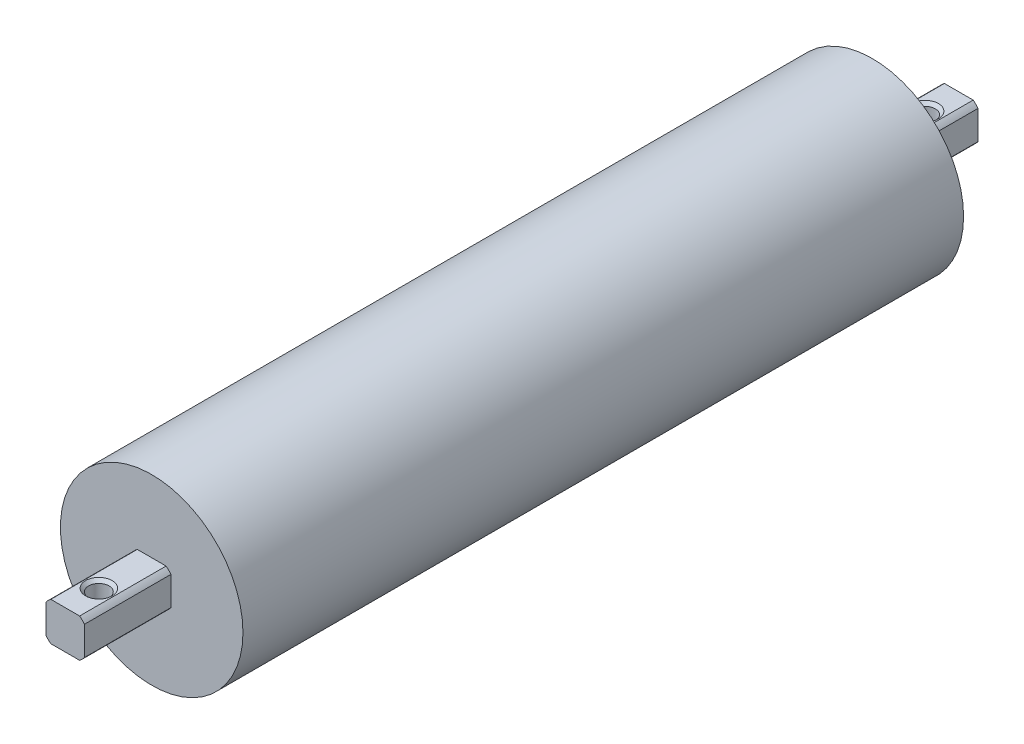
ISO-10303-21;
HEADER;
FILE_DESCRIPTION(('STEP AP214'),'2;1');
FILE_NAME('part.step','',(''),(''),'','','');
FILE_SCHEMA(('AUTOMOTIVE_DESIGN { 1 0 10303 214 1 1 1 1 }'));
ENDSEC;
DATA;
#1=APPLICATION_CONTEXT('core data for automotive mechanical design processes');
#2=APPLICATION_PROTOCOL_DEFINITION('international standard','automotive_design',2000,#1);
#3=PRODUCT_CONTEXT('',#1,'mechanical');
#4=PRODUCT('Part','Part','',(#3));
#5=PRODUCT_RELATED_PRODUCT_CATEGORY('part','',(#4));
#6=PRODUCT_DEFINITION_FORMATION('','',#4);
#7=PRODUCT_DEFINITION_CONTEXT('part definition',#1,'design');
#8=PRODUCT_DEFINITION('design','',#6,#7);
#9=PRODUCT_DEFINITION_SHAPE('','',#8);
#10=(LENGTH_UNIT() NAMED_UNIT(*) SI_UNIT(.MILLI.,.METRE.));
#11=(NAMED_UNIT(*) PLANE_ANGLE_UNIT() SI_UNIT($,.RADIAN.));
#12=(NAMED_UNIT(*) SI_UNIT($,.STERADIAN.) SOLID_ANGLE_UNIT());
#13=UNCERTAINTY_MEASURE_WITH_UNIT(LENGTH_MEASURE(1.E-05),#10,'distance_accuracy_value','');
#14=(GEOMETRIC_REPRESENTATION_CONTEXT(3) GLOBAL_UNCERTAINTY_ASSIGNED_CONTEXT((#13)) GLOBAL_UNIT_ASSIGNED_CONTEXT((#10,
#11,#12)) REPRESENTATION_CONTEXT('',''));
#15=CARTESIAN_POINT('',(0.,0.,0.));
#16=DIRECTION('',(0.,0.,1.));
#17=DIRECTION('',(1.,0.,0.));
#18=AXIS2_PLACEMENT_3D('',#15,#16,#17);
#19=CARTESIAN_POINT('',(0.,0.,-186.));
#20=DIRECTION('',(0.,0.,1.));
#21=DIRECTION('',(1.,0.,0.));
#22=AXIS2_PLACEMENT_3D('',#19,#20,#21);
#23=CYLINDRICAL_SURFACE('',#22,10.);
#24=DIRECTION('',(0.,0.,1.));
#25=VECTOR('',#24,1.);
#26=CARTESIAN_POINT('',(8.,-6.00000000000001,-186.));
#27=LINE('',#26,#25);
#28=CARTESIAN_POINT('',(8.,-6.00000000000001,-150.));
#29=VERTEX_POINT('',#28);
#30=CARTESIAN_POINT('',(8.,-6.00000000000001,-186.));
#31=VERTEX_POINT('',#30);
#32=EDGE_CURVE('E193',#29,#31,#27,.F.);
#33=ORIENTED_EDGE('',*,*,#32,.F.);
#34=CARTESIAN_POINT('',(0.,0.,-150.));
#35=DIRECTION('',(0.,0.,1.));
#36=DIRECTION('',(1.,0.,0.));
#37=AXIS2_PLACEMENT_3D('',#34,#35,#36);
#38=CIRCLE('',#37,10.);
#39=CARTESIAN_POINT('',(6.,-8.,-150.));
#40=VERTEX_POINT('',#39);
#41=EDGE_CURVE('E201',#40,#29,#38,.T.);
#42=ORIENTED_EDGE('',*,*,#41,.F.);
#43=DIRECTION('',(0.,0.,1.));
#44=VECTOR('',#43,1.);
#45=CARTESIAN_POINT('',(6.,-8.,-186.));
#46=LINE('',#45,#44);
#47=CARTESIAN_POINT('',(6.,-8.,-186.));
#48=VERTEX_POINT('',#47);
#49=EDGE_CURVE('E171',#48,#40,#46,.T.);
#50=ORIENTED_EDGE('',*,*,#49,.F.);
#51=CARTESIAN_POINT('',(0.,0.,-186.));
#52=DIRECTION('',(0.,0.,1.));
#53=DIRECTION('',(1.,0.,0.));
#54=AXIS2_PLACEMENT_3D('',#51,#52,#53);
#55=CIRCLE('',#54,10.);
#56=EDGE_CURVE('E179',#48,#31,#55,.T.);
#57=ORIENTED_EDGE('',*,*,#56,.T.);
#58=EDGE_LOOP('',(#33,#42,#50,#57));
#59=FACE_BOUND('',#58,.T.);
#60=ADVANCED_FACE('F47',(#59),#23,.T.);
#61=DIRECTION('',(0.,0.,1.));
#62=VECTOR('',#61,1.);
#63=CARTESIAN_POINT('',(8.,6.00000000000001,-186.));
#64=LINE('',#63,#62);
#65=CARTESIAN_POINT('',(8.,6.00000000000001,-186.));
#66=VERTEX_POINT('',#65);
#67=CARTESIAN_POINT('',(8.,6.00000000000001,-150.));
#68=VERTEX_POINT('',#67);
#69=EDGE_CURVE('E406',#66,#68,#64,.T.);
#70=ORIENTED_EDGE('',*,*,#69,.F.);
#71=CARTESIAN_POINT('',(6.,8.,-186.));
#72=VERTEX_POINT('',#71);
#73=EDGE_CURVE('E189',#66,#72,#55,.T.);
#74=ORIENTED_EDGE('',*,*,#73,.T.);
#75=DIRECTION('',(0.,0.,1.));
#76=VECTOR('',#75,1.);
#77=CARTESIAN_POINT('',(6.,8.,-186.));
#78=LINE('',#77,#76);
#79=CARTESIAN_POINT('',(6.,8.,-150.));
#80=VERTEX_POINT('',#79);
#81=EDGE_CURVE('E386',#80,#72,#78,.F.);
#82=ORIENTED_EDGE('',*,*,#81,.F.);
#83=EDGE_CURVE('E186',#68,#80,#38,.T.);
#84=ORIENTED_EDGE('',*,*,#83,.F.);
#85=EDGE_LOOP('',(#70,#74,#82,#84));
#86=FACE_BOUND('',#85,.T.);
#87=ADVANCED_FACE('F358',(#86),#23,.T.);
#88=DIRECTION('',(0.,0.,1.));
#89=VECTOR('',#88,1.);
#90=CARTESIAN_POINT('',(-6.,8.,-186.));
#91=LINE('',#90,#89);
#92=CARTESIAN_POINT('',(-6.,8.,-186.));
#93=VERTEX_POINT('',#92);
#94=CARTESIAN_POINT('',(-6.,8.,-150.));
#95=VERTEX_POINT('',#94);
#96=EDGE_CURVE('E385',#93,#95,#91,.T.);
#97=ORIENTED_EDGE('',*,*,#96,.F.);
#98=CARTESIAN_POINT('',(-8.,5.99999999999999,-186.));
#99=VERTEX_POINT('',#98);
#100=EDGE_CURVE('E182',#93,#99,#55,.T.);
#101=ORIENTED_EDGE('',*,*,#100,.T.);
#102=DIRECTION('',(0.,0.,1.));
#103=VECTOR('',#102,1.);
#104=CARTESIAN_POINT('',(-8.,5.99999999999999,-186.));
#105=LINE('',#104,#103);
#106=CARTESIAN_POINT('',(-8.,5.99999999999999,-150.));
#107=VERTEX_POINT('',#106);
#108=EDGE_CURVE('E388',#107,#99,#105,.F.);
#109=ORIENTED_EDGE('',*,*,#108,.F.);
#110=EDGE_CURVE('E199',#95,#107,#38,.T.);
#111=ORIENTED_EDGE('',*,*,#110,.F.);
#112=EDGE_LOOP('',(#97,#101,#109,#111));
#113=FACE_BOUND('',#112,.T.);
#114=ADVANCED_FACE('F361',(#113),#23,.T.);
#115=CARTESIAN_POINT('',(0.,0.,186.));
#116=DIRECTION('',(0.,0.,-1.));
#117=DIRECTION('',(-1.,0.,0.));
#118=AXIS2_PLACEMENT_3D('',#115,#116,#117);
#119=CYLINDRICAL_SURFACE('',#118,10.);
#120=DIRECTION('',(0.,0.,-1.));
#121=VECTOR('',#120,1.);
#122=CARTESIAN_POINT('',(8.,-6.00000000000001,186.));
#123=LINE('',#122,#121);
#124=CARTESIAN_POINT('',(8.,-6.00000000000001,186.));
#125=VERTEX_POINT('',#124);
#126=CARTESIAN_POINT('',(8.,-6.00000000000001,150.));
#127=VERTEX_POINT('',#126);
#128=EDGE_CURVE('E258',#125,#127,#123,.T.);
#129=ORIENTED_EDGE('',*,*,#128,.F.);
#130=CARTESIAN_POINT('',(0.,0.,186.));
#131=DIRECTION('',(0.,0.,1.));
#132=DIRECTION('',(1.,0.,0.));
#133=AXIS2_PLACEMENT_3D('',#130,#131,#132);
#134=CIRCLE('',#133,10.);
#135=CARTESIAN_POINT('',(6.,-8.,186.));
#136=VERTEX_POINT('',#135);
#137=EDGE_CURVE('E263',#136,#125,#134,.T.);
#138=ORIENTED_EDGE('',*,*,#137,.F.);
#139=DIRECTION('',(0.,0.,-1.));
#140=VECTOR('',#139,1.);
#141=CARTESIAN_POINT('',(6.,-8.,186.));
#142=LINE('',#141,#140);
#143=CARTESIAN_POINT('',(6.,-8.,150.));
#144=VERTEX_POINT('',#143);
#145=EDGE_CURVE('E252',#144,#136,#142,.F.);
#146=ORIENTED_EDGE('',*,*,#145,.F.);
#147=CARTESIAN_POINT('',(0.,0.,150.));
#148=DIRECTION('',(0.,0.,1.));
#149=DIRECTION('',(1.,0.,0.));
#150=AXIS2_PLACEMENT_3D('',#147,#148,#149);
#151=CIRCLE('',#150,10.);
#152=EDGE_CURVE('E274',#144,#127,#151,.T.);
#153=ORIENTED_EDGE('',*,*,#152,.T.);
#154=EDGE_LOOP('',(#129,#138,#146,#153));
#155=FACE_BOUND('',#154,.T.);
#156=ADVANCED_FACE('F319',(#155),#119,.T.);
#157=DIRECTION('',(0.,0.,-1.));
#158=VECTOR('',#157,1.);
#159=CARTESIAN_POINT('',(8.,6.00000000000001,186.));
#160=LINE('',#159,#158);
#161=CARTESIAN_POINT('',(8.,6.00000000000001,150.));
#162=VERTEX_POINT('',#161);
#163=CARTESIAN_POINT('',(8.,6.00000000000001,186.));
#164=VERTEX_POINT('',#163);
#165=EDGE_CURVE('E260',#162,#164,#160,.F.);
#166=ORIENTED_EDGE('',*,*,#165,.F.);
#167=CARTESIAN_POINT('',(6.,8.,150.));
#168=VERTEX_POINT('',#167);
#169=EDGE_CURVE('E231',#162,#168,#151,.T.);
#170=ORIENTED_EDGE('',*,*,#169,.T.);
#171=DIRECTION('',(0.,0.,-1.));
#172=VECTOR('',#171,1.);
#173=CARTESIAN_POINT('',(6.,8.,186.));
#174=LINE('',#173,#172);
#175=CARTESIAN_POINT('',(6.,8.,186.));
#176=VERTEX_POINT('',#175);
#177=EDGE_CURVE('E245',#176,#168,#174,.T.);
#178=ORIENTED_EDGE('',*,*,#177,.F.);
#179=EDGE_CURVE('E262',#164,#176,#134,.T.);
#180=ORIENTED_EDGE('',*,*,#179,.F.);
#181=EDGE_LOOP('',(#166,#170,#178,#180));
#182=FACE_BOUND('',#181,.T.);
#183=ADVANCED_FACE('F342',(#182),#119,.T.);
#184=DIRECTION('',(0.,0.,-1.));
#185=VECTOR('',#184,1.);
#186=CARTESIAN_POINT('',(-6.,-8.,186.));
#187=LINE('',#186,#185);
#188=CARTESIAN_POINT('',(-6.,-8.,186.));
#189=VERTEX_POINT('',#188);
#190=CARTESIAN_POINT('',(-6.,-8.,150.));
#191=VERTEX_POINT('',#190);
#192=EDGE_CURVE('E251',#189,#191,#187,.T.);
#193=ORIENTED_EDGE('',*,*,#192,.F.);
#194=CARTESIAN_POINT('',(-8.,-5.99999999999999,186.));
#195=VERTEX_POINT('',#194);
#196=EDGE_CURVE('E324',#195,#189,#134,.T.);
#197=ORIENTED_EDGE('',*,*,#196,.F.);
#198=DIRECTION('',(0.,0.,-1.));
#199=VECTOR('',#198,1.);
#200=CARTESIAN_POINT('',(-8.,-6.,186.));
#201=LINE('',#200,#199);
#202=CARTESIAN_POINT('',(-8.,-6.,150.));
#203=VERTEX_POINT('',#202);
#204=EDGE_CURVE('E244',#203,#195,#201,.F.);
#205=ORIENTED_EDGE('',*,*,#204,.F.);
#206=EDGE_CURVE('E310',#203,#191,#151,.T.);
#207=ORIENTED_EDGE('',*,*,#206,.T.);
#208=EDGE_LOOP('',(#193,#197,#205,#207));
#209=FACE_BOUND('',#208,.T.);
#210=ADVANCED_FACE('F311',(#209),#119,.T.);
#211=DIRECTION('',(0.,0.,-1.));
#212=VECTOR('',#211,1.);
#213=CARTESIAN_POINT('',(-8.,5.99999999999999,186.));
#214=LINE('',#213,#212);
#215=CARTESIAN_POINT('',(-8.,5.99999999999999,186.));
#216=VERTEX_POINT('',#215);
#217=CARTESIAN_POINT('',(-8.,5.99999999999999,150.));
#218=VERTEX_POINT('',#217);
#219=EDGE_CURVE('E247',#216,#218,#214,.T.);
#220=ORIENTED_EDGE('',*,*,#219,.F.);
#221=CARTESIAN_POINT('',(-6.,8.,186.));
#222=VERTEX_POINT('',#221);
#223=EDGE_CURVE('E268',#222,#216,#134,.T.);
#224=ORIENTED_EDGE('',*,*,#223,.F.);
#225=DIRECTION('',(0.,0.,-1.));
#226=VECTOR('',#225,1.);
#227=CARTESIAN_POINT('',(-6.,8.,186.));
#228=LINE('',#227,#226);
#229=CARTESIAN_POINT('',(-6.,8.,150.));
#230=VERTEX_POINT('',#229);
#231=EDGE_CURVE('E225',#230,#222,#228,.F.);
#232=ORIENTED_EDGE('',*,*,#231,.F.);
#233=EDGE_CURVE('E271',#230,#218,#151,.T.);
#234=ORIENTED_EDGE('',*,*,#233,.T.);
#235=EDGE_LOOP('',(#220,#224,#232,#234));
#236=FACE_BOUND('',#235,.T.);
#237=ADVANCED_FACE('F335',(#236),#119,.T.);
#238=CARTESIAN_POINT('',(0.,0.,186.));
#239=DIRECTION('',(0.,0.,1.));
#240=DIRECTION('',(1.,0.,0.));
#241=AXIS2_PLACEMENT_3D('',#238,#239,#240);
#242=PLANE('',#241);
#243=ORIENTED_EDGE('',*,*,#137,.T.);
#244=DIRECTION('',(0.,1.,0.));
#245=VECTOR('',#244,1.);
#246=CARTESIAN_POINT('',(8.,8.,186.));
#247=LINE('',#246,#245);
#248=EDGE_CURVE('E222',#125,#164,#247,.T.);
#249=ORIENTED_EDGE('',*,*,#248,.T.);
#250=ORIENTED_EDGE('',*,*,#179,.T.);
#251=DIRECTION('',(-1.,0.,0.));
#252=VECTOR('',#251,1.);
#253=CARTESIAN_POINT('',(-8.,8.,186.));
#254=LINE('',#253,#252);
#255=EDGE_CURVE('E226',#176,#222,#254,.T.);
#256=ORIENTED_EDGE('',*,*,#255,.T.);
#257=ORIENTED_EDGE('',*,*,#223,.T.);
#258=DIRECTION('',(0.,-1.,0.));
#259=VECTOR('',#258,1.);
#260=CARTESIAN_POINT('',(-8.,8.,186.));
#261=LINE('',#260,#259);
#262=EDGE_CURVE('E235',#216,#195,#261,.T.);
#263=ORIENTED_EDGE('',*,*,#262,.T.);
#264=ORIENTED_EDGE('',*,*,#196,.T.);
#265=DIRECTION('',(1.,0.,0.));
#266=VECTOR('',#265,1.);
#267=CARTESIAN_POINT('',(-8.,-8.,186.));
#268=LINE('',#267,#266);
#269=EDGE_CURVE('E227',#189,#136,#268,.T.);
#270=ORIENTED_EDGE('',*,*,#269,.T.);
#271=EDGE_LOOP('',(#243,#249,#250,#256,#257,#263,#264,#270));
#272=FACE_BOUND('',#271,.T.);
#273=ADVANCED_FACE('F325',(#272),#242,.T.);
#274=CARTESIAN_POINT('',(0.,0.,150.));
#275=DIRECTION('',(0.,0.,-1.));
#276=DIRECTION('',(-1.,0.,0.));
#277=AXIS2_PLACEMENT_3D('',#274,#275,#276);
#278=CYLINDRICAL_SURFACE('',#277,38.);
#279=CARTESIAN_POINT('',(0.,0.,150.));
#280=DIRECTION('',(0.,0.,1.));
#281=DIRECTION('',(1.,0.,0.));
#282=AXIS2_PLACEMENT_3D('',#279,#280,#281);
#283=CIRCLE('',#282,38.);
#284=CARTESIAN_POINT('',(38.,0.,150.));
#285=VERTEX_POINT('',#284);
#286=EDGE_CURVE('E273',#285,#285,#283,.T.);
#287=ORIENTED_EDGE('',*,*,#286,.F.);
#288=EDGE_LOOP('',(#287));
#289=FACE_BOUND('',#288,.T.);
#290=CARTESIAN_POINT('',(0.,0.,-150.));
#291=DIRECTION('',(0.,0.,1.));
#292=DIRECTION('',(1.,0.,0.));
#293=AXIS2_PLACEMENT_3D('',#290,#291,#292);
#294=CIRCLE('',#293,38.);
#295=CARTESIAN_POINT('',(38.,0.,-150.));
#296=VERTEX_POINT('',#295);
#297=EDGE_CURVE('E267',#296,#296,#294,.T.);
#298=ORIENTED_EDGE('',*,*,#297,.T.);
#299=EDGE_LOOP('',(#298));
#300=FACE_BOUND('',#299,.T.);
#301=ADVANCED_FACE('F51',(#289,#300),#278,.T.);
#302=CARTESIAN_POINT('',(0.,0.,150.));
#303=DIRECTION('',(0.,0.,1.));
#304=DIRECTION('',(1.,0.,0.));
#305=AXIS2_PLACEMENT_3D('',#302,#303,#304);
#306=PLANE('',#305);
#307=ORIENTED_EDGE('',*,*,#152,.F.);
#308=DIRECTION('',(1.,0.,0.));
#309=VECTOR('',#308,1.);
#310=CARTESIAN_POINT('',(-8.,-8.,150.));
#311=LINE('',#310,#309);
#312=EDGE_CURVE('E217',#191,#144,#311,.T.);
#313=ORIENTED_EDGE('',*,*,#312,.F.);
#314=ORIENTED_EDGE('',*,*,#206,.F.);
#315=DIRECTION('',(0.,-1.,0.));
#316=VECTOR('',#315,1.);
#317=CARTESIAN_POINT('',(-8.,8.,150.));
#318=LINE('',#317,#316);
#319=EDGE_CURVE('E216',#218,#203,#318,.T.);
#320=ORIENTED_EDGE('',*,*,#319,.F.);
#321=ORIENTED_EDGE('',*,*,#233,.F.);
#322=DIRECTION('',(-1.,0.,0.));
#323=VECTOR('',#322,1.);
#324=CARTESIAN_POINT('',(-8.,8.,150.));
#325=LINE('',#324,#323);
#326=EDGE_CURVE('E214',#168,#230,#325,.T.);
#327=ORIENTED_EDGE('',*,*,#326,.F.);
#328=ORIENTED_EDGE('',*,*,#169,.F.);
#329=DIRECTION('',(0.,1.,0.));
#330=VECTOR('',#329,1.);
#331=CARTESIAN_POINT('',(8.,8.,150.));
#332=LINE('',#331,#330);
#333=EDGE_CURVE('E208',#127,#162,#332,.T.);
#334=ORIENTED_EDGE('',*,*,#333,.F.);
#335=EDGE_LOOP('',(#307,#313,#314,#320,#321,#327,#328,#334));
#336=FACE_BOUND('',#335,.T.);
#337=ORIENTED_EDGE('',*,*,#286,.T.);
#338=EDGE_LOOP('',(#337));
#339=FACE_BOUND('',#338,.T.);
#340=ADVANCED_FACE('F302',(#336,#339),#306,.T.);
#341=CARTESIAN_POINT('',(0.,0.,-150.));
#342=DIRECTION('',(0.,0.,1.));
#343=DIRECTION('',(1.,0.,0.));
#344=AXIS2_PLACEMENT_3D('',#341,#342,#343);
#345=PLANE('',#344);
#346=ORIENTED_EDGE('',*,*,#41,.T.);
#347=DIRECTION('',(0.,1.,0.));
#348=VECTOR('',#347,1.);
#349=CARTESIAN_POINT('',(8.,8.,-150.));
#350=LINE('',#349,#348);
#351=EDGE_CURVE('E457',#29,#68,#350,.T.);
#352=ORIENTED_EDGE('',*,*,#351,.T.);
#353=ORIENTED_EDGE('',*,*,#83,.T.);
#354=DIRECTION('',(-1.,0.,0.));
#355=VECTOR('',#354,1.);
#356=CARTESIAN_POINT('',(-8.,8.,-150.));
#357=LINE('',#356,#355);
#358=EDGE_CURVE('E405',#80,#95,#357,.T.);
#359=ORIENTED_EDGE('',*,*,#358,.T.);
#360=ORIENTED_EDGE('',*,*,#110,.T.);
#361=DIRECTION('',(0.,-1.,0.));
#362=VECTOR('',#361,1.);
#363=CARTESIAN_POINT('',(-8.,8.,-150.));
#364=LINE('',#363,#362);
#365=CARTESIAN_POINT('',(-8.,-5.99999999999999,-150.));
#366=VERTEX_POINT('',#365);
#367=EDGE_CURVE('E424',#107,#366,#364,.T.);
#368=ORIENTED_EDGE('',*,*,#367,.T.);
#369=CARTESIAN_POINT('',(-6.,-8.,-150.));
#370=VERTEX_POINT('',#369);
#371=EDGE_CURVE('E420',#366,#370,#38,.T.);
#372=ORIENTED_EDGE('',*,*,#371,.T.);
#373=DIRECTION('',(1.,0.,0.));
#374=VECTOR('',#373,1.);
#375=CARTESIAN_POINT('',(-8.,-8.,-150.));
#376=LINE('',#375,#374);
#377=EDGE_CURVE('E165',#370,#40,#376,.T.);
#378=ORIENTED_EDGE('',*,*,#377,.T.);
#379=EDGE_LOOP('',(#346,#352,#353,#359,#360,#368,#372,#378));
#380=FACE_BOUND('',#379,.T.);
#381=ORIENTED_EDGE('',*,*,#297,.F.);
#382=EDGE_LOOP('',(#381));
#383=FACE_BOUND('',#382,.T.);
#384=ADVANCED_FACE('F421',(#380,#383),#345,.F.);
#385=CARTESIAN_POINT('',(-8.,8.,150.));
#386=DIRECTION('',(0.,1.,0.));
#387=DIRECTION('',(0.,0.,1.));
#388=AXIS2_PLACEMENT_3D('',#385,#386,#387);
#389=PLANE('',#388);
#390=CARTESIAN_POINT('',(0.,8.,172.));
#391=DIRECTION('',(0.,1.,0.));
#392=DIRECTION('',(0.,0.,1.));
#393=AXIS2_PLACEMENT_3D('',#390,#391,#392);
#394=CIRCLE('',#393,5.525);
#395=CARTESIAN_POINT('',(0.,8.,177.525));
#396=VERTEX_POINT('',#395);
#397=EDGE_CURVE('E191',#396,#396,#394,.T.);
#398=ORIENTED_EDGE('',*,*,#397,.F.);
#399=EDGE_LOOP('',(#398));
#400=FACE_BOUND('',#399,.T.);
#401=ORIENTED_EDGE('',*,*,#177,.T.);
#402=ORIENTED_EDGE('',*,*,#326,.T.);
#403=ORIENTED_EDGE('',*,*,#231,.T.);
#404=ORIENTED_EDGE('',*,*,#255,.F.);
#405=EDGE_LOOP('',(#401,#402,#403,#404));
#406=FACE_BOUND('',#405,.T.);
#407=ADVANCED_FACE('F527',(#400,#406),#389,.T.);
#408=CARTESIAN_POINT('',(-8.,8.,150.));
#409=DIRECTION('',(-1.,0.,0.));
#410=DIRECTION('',(0.,-1.,0.));
#411=AXIS2_PLACEMENT_3D('',#408,#409,#410);
#412=PLANE('',#411);
#413=ORIENTED_EDGE('',*,*,#219,.T.);
#414=ORIENTED_EDGE('',*,*,#319,.T.);
#415=ORIENTED_EDGE('',*,*,#204,.T.);
#416=ORIENTED_EDGE('',*,*,#262,.F.);
#417=EDGE_LOOP('',(#413,#414,#415,#416));
#418=FACE_BOUND('',#417,.T.);
#419=ADVANCED_FACE('F292',(#418),#412,.T.);
#420=CARTESIAN_POINT('',(-8.,-8.,150.));
#421=DIRECTION('',(0.,-1.,0.));
#422=DIRECTION('',(0.,0.,-1.));
#423=AXIS2_PLACEMENT_3D('',#420,#421,#422);
#424=PLANE('',#423);
#425=CARTESIAN_POINT('',(0.,-8.,172.));
#426=DIRECTION('',(0.,-1.,0.));
#427=DIRECTION('',(0.,0.,-1.));
#428=AXIS2_PLACEMENT_3D('',#425,#426,#427);
#429=CIRCLE('',#428,4.25);
#430=CARTESIAN_POINT('',(0.,-8.,167.75));
#431=VERTEX_POINT('',#430);
#432=EDGE_CURVE('E209',#431,#431,#429,.T.);
#433=ORIENTED_EDGE('',*,*,#432,.F.);
#434=EDGE_LOOP('',(#433));
#435=FACE_BOUND('',#434,.T.);
#436=ORIENTED_EDGE('',*,*,#192,.T.);
#437=ORIENTED_EDGE('',*,*,#312,.T.);
#438=ORIENTED_EDGE('',*,*,#145,.T.);
#439=ORIENTED_EDGE('',*,*,#269,.F.);
#440=EDGE_LOOP('',(#436,#437,#438,#439));
#441=FACE_BOUND('',#440,.T.);
#442=ADVANCED_FACE('F287',(#435,#441),#424,.T.);
#443=CARTESIAN_POINT('',(8.,8.,150.));
#444=DIRECTION('',(1.,0.,0.));
#445=DIRECTION('',(0.,0.,-1.));
#446=AXIS2_PLACEMENT_3D('',#443,#444,#445);
#447=PLANE('',#446);
#448=ORIENTED_EDGE('',*,*,#128,.T.);
#449=ORIENTED_EDGE('',*,*,#333,.T.);
#450=ORIENTED_EDGE('',*,*,#165,.T.);
#451=ORIENTED_EDGE('',*,*,#248,.F.);
#452=EDGE_LOOP('',(#448,#449,#450,#451));
#453=FACE_BOUND('',#452,.T.);
#454=ADVANCED_FACE('F293',(#453),#447,.T.);
#455=CARTESIAN_POINT('',(0.,8.,172.));
#456=DIRECTION('',(0.,1.,0.));
#457=DIRECTION('',(0.,0.,1.));
#458=AXIS2_PLACEMENT_3D('',#455,#456,#457);
#459=CYLINDRICAL_SURFACE('',#458,4.25);
#460=ORIENTED_EDGE('',*,*,#432,.T.);
#461=EDGE_LOOP('',(#460));
#462=FACE_BOUND('',#461,.T.);
#463=CARTESIAN_POINT('',(0.,6.725,172.));
#464=DIRECTION('',(0.,1.,0.));
#465=DIRECTION('',(0.,0.,1.));
#466=AXIS2_PLACEMENT_3D('',#463,#464,#465);
#467=CIRCLE('',#466,4.25);
#468=CARTESIAN_POINT('',(0.,6.725,176.25));
#469=VERTEX_POINT('',#468);
#470=EDGE_CURVE('E204',#469,#469,#467,.T.);
#471=ORIENTED_EDGE('',*,*,#470,.T.);
#472=EDGE_LOOP('',(#471));
#473=FACE_BOUND('',#472,.T.);
#474=ADVANCED_FACE('F284',(#462,#473),#459,.F.);
#475=CARTESIAN_POINT('',(0.,8.,172.));
#476=DIRECTION('',(0.,1.,0.));
#477=DIRECTION('',(0.,0.,1.));
#478=AXIS2_PLACEMENT_3D('',#475,#476,#477);
#479=CONICAL_SURFACE('',#478,5.525,0.78539816339745);
#480=ORIENTED_EDGE('',*,*,#470,.F.);
#481=EDGE_LOOP('',(#480));
#482=FACE_BOUND('',#481,.T.);
#483=ORIENTED_EDGE('',*,*,#397,.T.);
#484=EDGE_LOOP('',(#483));
#485=FACE_BOUND('',#484,.T.);
#486=ADVANCED_FACE('F351',(#482,#485),#479,.F.);
#487=DIRECTION('',(0.,0.,1.));
#488=VECTOR('',#487,1.);
#489=CARTESIAN_POINT('',(-8.,-6.,-186.));
#490=LINE('',#489,#488);
#491=CARTESIAN_POINT('',(-8.,-6.,-186.));
#492=VERTEX_POINT('',#491);
#493=EDGE_CURVE('E167',#492,#366,#490,.T.);
#494=ORIENTED_EDGE('',*,*,#493,.F.);
#495=CARTESIAN_POINT('',(-6.,-8.,-186.));
#496=VERTEX_POINT('',#495);
#497=EDGE_CURVE('E180',#492,#496,#55,.T.);
#498=ORIENTED_EDGE('',*,*,#497,.T.);
#499=DIRECTION('',(0.,0.,1.));
#500=VECTOR('',#499,1.);
#501=CARTESIAN_POINT('',(-6.,-8.,-186.));
#502=LINE('',#501,#500);
#503=EDGE_CURVE('E163',#370,#496,#502,.F.);
#504=ORIENTED_EDGE('',*,*,#503,.F.);
#505=ORIENTED_EDGE('',*,*,#371,.F.);
#506=EDGE_LOOP('',(#494,#498,#504,#505));
#507=FACE_BOUND('',#506,.T.);
#508=ADVANCED_FACE('F181',(#507),#23,.T.);
#509=CARTESIAN_POINT('',(0.,0.,-186.));
#510=DIRECTION('',(0.,0.,-1.));
#511=DIRECTION('',(1.,0.,0.));
#512=AXIS2_PLACEMENT_3D('',#509,#510,#511);
#513=PLANE('',#512);
#514=DIRECTION('',(1.,0.,0.));
#515=VECTOR('',#514,1.);
#516=CARTESIAN_POINT('',(-8.,-8.,-186.));
#517=LINE('',#516,#515);
#518=EDGE_CURVE('E12',#496,#48,#517,.T.);
#519=ORIENTED_EDGE('',*,*,#518,.F.);
#520=ORIENTED_EDGE('',*,*,#497,.F.);
#521=DIRECTION('',(0.,-1.,0.));
#522=VECTOR('',#521,1.);
#523=CARTESIAN_POINT('',(-8.,8.,-186.));
#524=LINE('',#523,#522);
#525=EDGE_CURVE('E72',#99,#492,#524,.T.);
#526=ORIENTED_EDGE('',*,*,#525,.F.);
#527=ORIENTED_EDGE('',*,*,#100,.F.);
#528=DIRECTION('',(-1.,0.,0.));
#529=VECTOR('',#528,1.);
#530=CARTESIAN_POINT('',(-8.,8.,-186.));
#531=LINE('',#530,#529);
#532=EDGE_CURVE('E392',#72,#93,#531,.T.);
#533=ORIENTED_EDGE('',*,*,#532,.F.);
#534=ORIENTED_EDGE('',*,*,#73,.F.);
#535=DIRECTION('',(0.,1.,0.));
#536=VECTOR('',#535,1.);
#537=CARTESIAN_POINT('',(8.,8.,-186.));
#538=LINE('',#537,#536);
#539=EDGE_CURVE('E56',#31,#66,#538,.T.);
#540=ORIENTED_EDGE('',*,*,#539,.F.);
#541=ORIENTED_EDGE('',*,*,#56,.F.);
#542=EDGE_LOOP('',(#519,#520,#526,#527,#533,#534,#540,#541));
#543=FACE_BOUND('',#542,.T.);
#544=ADVANCED_FACE('F176',(#543),#513,.T.);
#545=CARTESIAN_POINT('',(-8.,-8.,-150.));
#546=DIRECTION('',(0.,1.,0.));
#547=DIRECTION('',(0.,0.,1.));
#548=AXIS2_PLACEMENT_3D('',#545,#546,#547);
#549=PLANE('',#548);
#550=CARTESIAN_POINT('',(0.,-8.,-172.));
#551=DIRECTION('',(0.,1.,0.));
#552=DIRECTION('',(0.,0.,1.));
#553=AXIS2_PLACEMENT_3D('',#550,#551,#552);
#554=CIRCLE('',#553,4.25);
#555=CARTESIAN_POINT('',(0.,-8.,-167.75));
#556=VERTEX_POINT('',#555);
#557=EDGE_CURVE('E52',#556,#556,#554,.T.);
#558=ORIENTED_EDGE('',*,*,#557,.T.);
#559=EDGE_LOOP('',(#558));
#560=FACE_BOUND('',#559,.T.);
#561=ORIENTED_EDGE('',*,*,#503,.T.);
#562=ORIENTED_EDGE('',*,*,#518,.T.);
#563=ORIENTED_EDGE('',*,*,#49,.T.);
#564=ORIENTED_EDGE('',*,*,#377,.F.);
#565=EDGE_LOOP('',(#561,#562,#563,#564));
#566=FACE_BOUND('',#565,.T.);
#567=ADVANCED_FACE('F162',(#560,#566),#549,.F.);
#568=CARTESIAN_POINT('',(-8.,8.,-150.));
#569=DIRECTION('',(1.,0.,0.));
#570=DIRECTION('',(0.,1.,0.));
#571=AXIS2_PLACEMENT_3D('',#568,#569,#570);
#572=PLANE('',#571);
#573=ORIENTED_EDGE('',*,*,#108,.T.);
#574=ORIENTED_EDGE('',*,*,#525,.T.);
#575=ORIENTED_EDGE('',*,*,#493,.T.);
#576=ORIENTED_EDGE('',*,*,#367,.F.);
#577=EDGE_LOOP('',(#573,#574,#575,#576));
#578=FACE_BOUND('',#577,.T.);
#579=ADVANCED_FACE('F440',(#578),#572,.F.);
#580=CARTESIAN_POINT('',(-8.,8.,-150.));
#581=DIRECTION('',(0.,-1.,0.));
#582=DIRECTION('',(0.,0.,-1.));
#583=AXIS2_PLACEMENT_3D('',#580,#581,#582);
#584=PLANE('',#583);
#585=CARTESIAN_POINT('',(0.,8.,-172.));
#586=DIRECTION('',(0.,1.,0.));
#587=DIRECTION('',(0.,0.,1.));
#588=AXIS2_PLACEMENT_3D('',#585,#586,#587);
#589=CIRCLE('',#588,5.525);
#590=CARTESIAN_POINT('',(0.,8.,-166.475));
#591=VERTEX_POINT('',#590);
#592=EDGE_CURVE('E464',#591,#591,#589,.T.);
#593=ORIENTED_EDGE('',*,*,#592,.F.);
#594=EDGE_LOOP('',(#593));
#595=FACE_BOUND('',#594,.T.);
#596=ORIENTED_EDGE('',*,*,#81,.T.);
#597=ORIENTED_EDGE('',*,*,#532,.T.);
#598=ORIENTED_EDGE('',*,*,#96,.T.);
#599=ORIENTED_EDGE('',*,*,#358,.F.);
#600=EDGE_LOOP('',(#596,#597,#598,#599));
#601=FACE_BOUND('',#600,.T.);
#602=ADVANCED_FACE('F434',(#595,#601),#584,.F.);
#603=CARTESIAN_POINT('',(8.,8.,-150.));
#604=DIRECTION('',(-1.,0.,0.));
#605=DIRECTION('',(0.,0.,1.));
#606=AXIS2_PLACEMENT_3D('',#603,#604,#605);
#607=PLANE('',#606);
#608=ORIENTED_EDGE('',*,*,#32,.T.);
#609=ORIENTED_EDGE('',*,*,#539,.T.);
#610=ORIENTED_EDGE('',*,*,#69,.T.);
#611=ORIENTED_EDGE('',*,*,#351,.F.);
#612=EDGE_LOOP('',(#608,#609,#610,#611));
#613=FACE_BOUND('',#612,.T.);
#614=ADVANCED_FACE('F432',(#613),#607,.F.);
#615=CARTESIAN_POINT('',(0.,8.,-172.));
#616=DIRECTION('',(0.,1.,0.));
#617=DIRECTION('',(0.,0.,1.));
#618=AXIS2_PLACEMENT_3D('',#615,#616,#617);
#619=CYLINDRICAL_SURFACE('',#618,4.25);
#620=CARTESIAN_POINT('',(0.,6.725,-172.));
#621=DIRECTION('',(0.,1.,0.));
#622=DIRECTION('',(0.,0.,1.));
#623=AXIS2_PLACEMENT_3D('',#620,#621,#622);
#624=CIRCLE('',#623,4.25);
#625=CARTESIAN_POINT('',(0.,6.725,-167.75));
#626=VERTEX_POINT('',#625);
#627=EDGE_CURVE('E459',#626,#626,#624,.T.);
#628=ORIENTED_EDGE('',*,*,#627,.T.);
#629=EDGE_LOOP('',(#628));
#630=FACE_BOUND('',#629,.T.);
#631=ORIENTED_EDGE('',*,*,#557,.F.);
#632=EDGE_LOOP('',(#631));
#633=FACE_BOUND('',#632,.T.);
#634=ADVANCED_FACE('F443',(#630,#633),#619,.F.);
#635=CARTESIAN_POINT('',(0.,8.,-172.));
#636=DIRECTION('',(0.,1.,0.));
#637=DIRECTION('',(0.,0.,1.));
#638=AXIS2_PLACEMENT_3D('',#635,#636,#637);
#639=CONICAL_SURFACE('',#638,5.525,0.78539816339745);
#640=ORIENTED_EDGE('',*,*,#627,.F.);
#641=EDGE_LOOP('',(#640));
#642=FACE_BOUND('',#641,.T.);
#643=ORIENTED_EDGE('',*,*,#592,.T.);
#644=EDGE_LOOP('',(#643));
#645=FACE_BOUND('',#644,.T.);
#646=ADVANCED_FACE('F471',(#642,#645),#639,.F.);
#647=CLOSED_SHELL('',(#60,#87,#114,#156,#183,#210,#237,#273,#301,#340,#384,#407,#419,#442,#454,
#474,#486,#508,#544,#567,#579,#602,#614,#634,#646));
#648=MANIFOLD_SOLID_BREP('B2',#647);
#649=ADVANCED_BREP_SHAPE_REPRESENTATION('',(#18,#648),#14);
#650=SHAPE_DEFINITION_REPRESENTATION(#9,#649);
ENDSEC;
END-ISO-10303-21;
